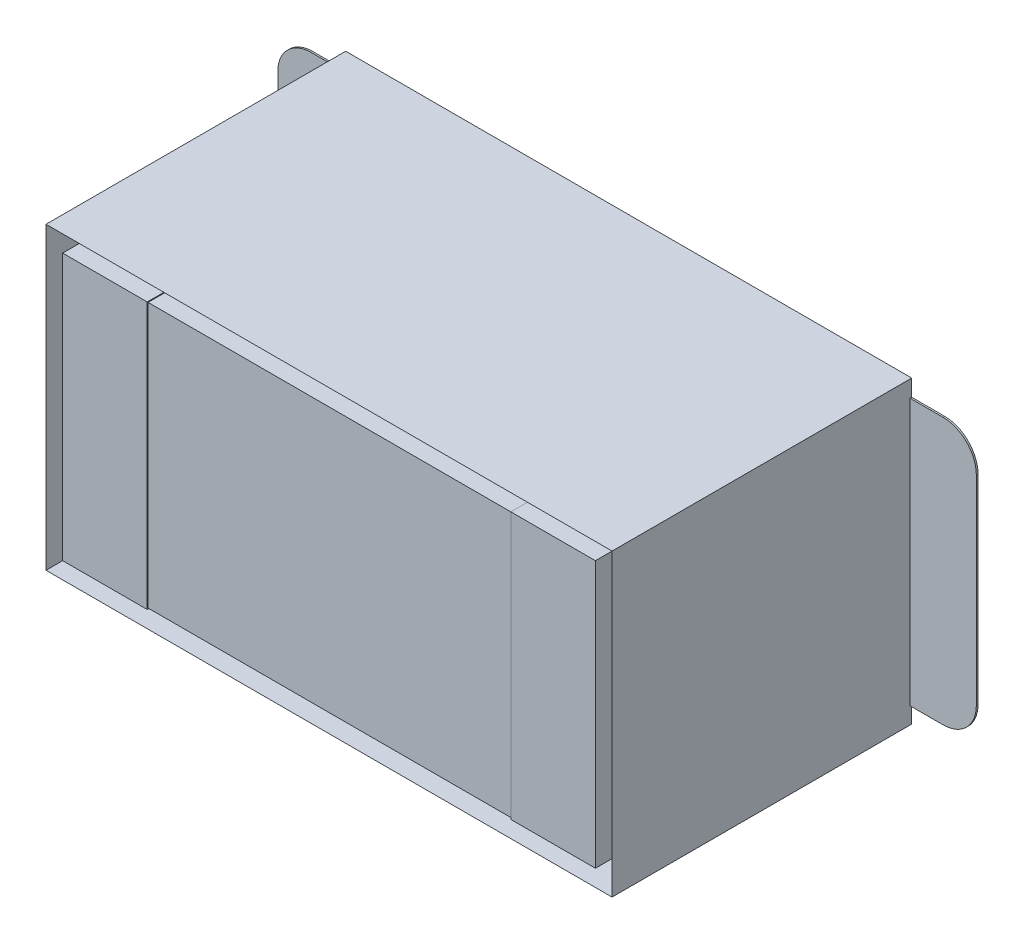
ISO-10303-21;
HEADER;
FILE_DESCRIPTION(('STEP AP214'),'2;1');
FILE_NAME('part.step','',(''),(''),'','','');
FILE_SCHEMA(('AUTOMOTIVE_DESIGN { 1 0 10303 214 1 1 1 1 }'));
ENDSEC;
DATA;
#1=APPLICATION_CONTEXT('core data for automotive mechanical design processes');
#2=APPLICATION_PROTOCOL_DEFINITION('international standard','automotive_design',2000,#1);
#3=PRODUCT_CONTEXT('',#1,'mechanical');
#4=PRODUCT('Part','Part','',(#3));
#5=PRODUCT_RELATED_PRODUCT_CATEGORY('part','',(#4));
#6=PRODUCT_DEFINITION_FORMATION('','',#4);
#7=PRODUCT_DEFINITION_CONTEXT('part definition',#1,'design');
#8=PRODUCT_DEFINITION('design','',#6,#7);
#9=PRODUCT_DEFINITION_SHAPE('','',#8);
#10=(LENGTH_UNIT() NAMED_UNIT(*) SI_UNIT(.MILLI.,.METRE.));
#11=(NAMED_UNIT(*) PLANE_ANGLE_UNIT() SI_UNIT($,.RADIAN.));
#12=(NAMED_UNIT(*) SI_UNIT($,.STERADIAN.) SOLID_ANGLE_UNIT());
#13=UNCERTAINTY_MEASURE_WITH_UNIT(LENGTH_MEASURE(1.E-05),#10,'distance_accuracy_value','');
#14=(GEOMETRIC_REPRESENTATION_CONTEXT(3) GLOBAL_UNCERTAINTY_ASSIGNED_CONTEXT((#13)) GLOBAL_UNIT_ASSIGNED_CONTEXT((#10,
#11,#12)) REPRESENTATION_CONTEXT('',''));
#15=CARTESIAN_POINT('',(0.,0.,0.));
#16=DIRECTION('',(0.,0.,1.));
#17=DIRECTION('',(1.,0.,0.));
#18=AXIS2_PLACEMENT_3D('',#15,#16,#17);
#19=CARTESIAN_POINT('',(-1.898000149415,0.600000149415,0.0762));
#20=DIRECTION('',(0.,0.,1.));
#21=DIRECTION('',(1.,0.,0.));
#22=AXIS2_PLACEMENT_3D('',#19,#20,#21);
#23=CYLINDRICAL_SURFACE('',#22,0.199999850585);
#24=DIRECTION('',(0.,0.,1.));
#25=VECTOR('',#24,1.);
#26=CARTESIAN_POINT('',(-2.098,0.6,0.0762));
#27=LINE('',#26,#25);
#28=CARTESIAN_POINT('',(-2.098,0.6,0.0762));
#29=VERTEX_POINT('',#28);
#30=CARTESIAN_POINT('',(-2.098,0.6,0.0862));
#31=VERTEX_POINT('',#30);
#32=EDGE_CURVE('P0_E11',#29,#31,#27,.T.);
#33=ORIENTED_EDGE('',*,*,#32,.T.);
#34=CARTESIAN_POINT('',(-1.898000149415,0.600000149415,0.0862));
#35=DIRECTION('',(0.,0.,1.));
#36=DIRECTION('',(7.47075740949116E-07,0.999999999999721,0.));
#37=AXIS2_PLACEMENT_3D('',#34,#35,#36);
#38=CIRCLE('',#37,0.199999850585);
#39=CARTESIAN_POINT('',(-1.898,0.8,0.0862));
#40=VERTEX_POINT('',#39);
#41=EDGE_CURVE('P0_E425',#40,#31,#38,.T.);
#42=ORIENTED_EDGE('',*,*,#41,.F.);
#43=DIRECTION('',(0.,0.,1.));
#44=VECTOR('',#43,1.);
#45=CARTESIAN_POINT('',(-1.898,0.8,0.0762));
#46=LINE('',#45,#44);
#47=CARTESIAN_POINT('',(-1.898,0.8,0.0762));
#48=VERTEX_POINT('',#47);
#49=EDGE_CURVE('P0_E451',#48,#40,#46,.T.);
#50=ORIENTED_EDGE('',*,*,#49,.F.);
#51=CARTESIAN_POINT('',(-1.898000149415,0.600000149415,0.0762));
#52=DIRECTION('',(0.,0.,1.));
#53=DIRECTION('',(7.47075740949116E-07,0.999999999999721,0.));
#54=AXIS2_PLACEMENT_3D('',#51,#52,#53);
#55=CIRCLE('',#54,0.199999850585);
#56=EDGE_CURVE('P0_E387',#48,#29,#55,.T.);
#57=ORIENTED_EDGE('',*,*,#56,.T.);
#58=EDGE_LOOP('',(#33,#42,#50,#57));
#59=FACE_BOUND('',#58,.T.);
#60=ADVANCED_FACE('P0_F18',(#59),#23,.T.);
#61=CARTESIAN_POINT('',(-2.098,0.6,0.0762));
#62=DIRECTION('',(-1.,0.,0.));
#63=DIRECTION('',(0.,0.,1.));
#64=AXIS2_PLACEMENT_3D('',#61,#62,#63);
#65=PLANE('',#64);
#66=DIRECTION('',(0.,0.,1.));
#67=VECTOR('',#66,1.);
#68=CARTESIAN_POINT('',(-2.098,-0.6,0.0762));
#69=LINE('',#68,#67);
#70=CARTESIAN_POINT('',(-2.098,-0.6,0.0762));
#71=VERTEX_POINT('',#70);
#72=CARTESIAN_POINT('',(-2.098,-0.6,0.0862));
#73=VERTEX_POINT('',#72);
#74=EDGE_CURVE('P0_E29',#71,#73,#69,.T.);
#75=ORIENTED_EDGE('',*,*,#74,.T.);
#76=DIRECTION('',(0.,-1.,0.));
#77=VECTOR('',#76,1.);
#78=CARTESIAN_POINT('',(-2.098,0.6,0.0862));
#79=LINE('',#78,#77);
#80=EDGE_CURVE('P0_E445',#31,#73,#79,.T.);
#81=ORIENTED_EDGE('',*,*,#80,.F.);
#82=ORIENTED_EDGE('',*,*,#32,.F.);
#83=DIRECTION('',(0.,-1.,0.));
#84=VECTOR('',#83,1.);
#85=CARTESIAN_POINT('',(-2.098,0.6,0.0762));
#86=LINE('',#85,#84);
#87=EDGE_CURVE('P0_E383',#29,#71,#86,.T.);
#88=ORIENTED_EDGE('',*,*,#87,.T.);
#89=EDGE_LOOP('',(#75,#81,#82,#88));
#90=FACE_BOUND('',#89,.T.);
#91=ADVANCED_FACE('P0_F1147',(#90),#65,.T.);
#92=CARTESIAN_POINT('',(-1.898000149415,-0.600000149415,0.0762));
#93=DIRECTION('',(0.,0.,1.));
#94=DIRECTION('',(1.,0.,0.));
#95=AXIS2_PLACEMENT_3D('',#92,#93,#94);
#96=CYLINDRICAL_SURFACE('',#95,0.199999850585);
#97=DIRECTION('',(0.,0.,1.));
#98=VECTOR('',#97,1.);
#99=CARTESIAN_POINT('',(-1.898,-0.8,0.0762));
#100=LINE('',#99,#98);
#101=CARTESIAN_POINT('',(-1.898,-0.8,0.0762));
#102=VERTEX_POINT('',#101);
#103=CARTESIAN_POINT('',(-1.898,-0.8,0.0862));
#104=VERTEX_POINT('',#103);
#105=EDGE_CURVE('P0_E334',#102,#104,#100,.T.);
#106=ORIENTED_EDGE('',*,*,#105,.T.);
#107=CARTESIAN_POINT('',(-1.898000149415,-0.600000149415,0.0862));
#108=DIRECTION('',(0.,0.,1.));
#109=DIRECTION('',(-0.999999999999721,7.47075741504216E-07,0.));
#110=AXIS2_PLACEMENT_3D('',#107,#108,#109);
#111=CIRCLE('',#110,0.199999850585);
#112=EDGE_CURVE('P0_E322',#73,#104,#111,.T.);
#113=ORIENTED_EDGE('',*,*,#112,.F.);
#114=ORIENTED_EDGE('',*,*,#74,.F.);
#115=CARTESIAN_POINT('',(-1.898000149415,-0.600000149415,0.0762));
#116=DIRECTION('',(0.,0.,1.));
#117=DIRECTION('',(-0.999999999999721,7.47075741504216E-07,0.));
#118=AXIS2_PLACEMENT_3D('',#115,#116,#117);
#119=CIRCLE('',#118,0.199999850585);
#120=EDGE_CURVE('P0_E388',#71,#102,#119,.T.);
#121=ORIENTED_EDGE('',*,*,#120,.T.);
#122=EDGE_LOOP('',(#106,#113,#114,#121));
#123=FACE_BOUND('',#122,.T.);
#124=ADVANCED_FACE('P0_F1141',(#123),#96,.T.);
#125=CARTESIAN_POINT('',(-1.047999850585,0.600000149415,0.0762));
#126=DIRECTION('',(0.,0.,1.));
#127=DIRECTION('',(1.,0.,0.));
#128=AXIS2_PLACEMENT_3D('',#125,#126,#127);
#129=CYLINDRICAL_SURFACE('',#128,0.199999850585);
#130=DIRECTION('',(0.,0.,1.));
#131=VECTOR('',#130,1.);
#132=CARTESIAN_POINT('',(-1.048,0.8,0.0762));
#133=LINE('',#132,#131);
#134=CARTESIAN_POINT('',(-1.048,0.8,0.0762));
#135=VERTEX_POINT('',#134);
#136=CARTESIAN_POINT('',(-1.048,0.8,0.0862));
#137=VERTEX_POINT('',#136);
#138=EDGE_CURVE('P0_E349',#135,#137,#133,.T.);
#139=ORIENTED_EDGE('',*,*,#138,.T.);
#140=CARTESIAN_POINT('',(-1.047999850585,0.600000149415,0.0862));
#141=DIRECTION('',(0.,0.,1.));
#142=DIRECTION('',(0.999999999999721,-7.47075741504216E-07,0.));
#143=AXIS2_PLACEMENT_3D('',#140,#141,#142);
#144=CIRCLE('',#143,0.199999850585);
#145=CARTESIAN_POINT('',(-0.848,0.6,0.0862));
#146=VERTEX_POINT('',#145);
#147=EDGE_CURVE('P0_E312',#146,#137,#144,.T.);
#148=ORIENTED_EDGE('',*,*,#147,.F.);
#149=DIRECTION('',(0.,0.,1.));
#150=VECTOR('',#149,1.);
#151=CARTESIAN_POINT('',(-0.848,0.6,0.0762));
#152=LINE('',#151,#150);
#153=CARTESIAN_POINT('',(-0.848,0.6,0.0762));
#154=VERTEX_POINT('',#153);
#155=EDGE_CURVE('P0_E326',#154,#146,#152,.T.);
#156=ORIENTED_EDGE('',*,*,#155,.F.);
#157=CARTESIAN_POINT('',(-1.047999850585,0.600000149415,0.0762));
#158=DIRECTION('',(0.,0.,1.));
#159=DIRECTION('',(0.999999999999721,-7.47075741504216E-07,0.));
#160=AXIS2_PLACEMENT_3D('',#157,#158,#159);
#161=CIRCLE('',#160,0.199999850585);
#162=EDGE_CURVE('P0_E397',#154,#135,#161,.T.);
#163=ORIENTED_EDGE('',*,*,#162,.T.);
#164=EDGE_LOOP('',(#139,#148,#156,#163));
#165=FACE_BOUND('',#164,.T.);
#166=ADVANCED_FACE('P0_F1146',(#165),#129,.T.);
#167=CARTESIAN_POINT('',(-0.848,-0.6,0.0762));
#168=DIRECTION('',(1.,0.,0.));
#169=DIRECTION('',(0.,1.,0.));
#170=AXIS2_PLACEMENT_3D('',#167,#168,#169);
#171=PLANE('',#170);
#172=ORIENTED_EDGE('',*,*,#155,.T.);
#173=DIRECTION('',(0.,1.,0.));
#174=VECTOR('',#173,1.);
#175=CARTESIAN_POINT('',(-0.848,-0.6,0.0862));
#176=LINE('',#175,#174);
#177=CARTESIAN_POINT('',(-0.848,-0.6,0.0862));
#178=VERTEX_POINT('',#177);
#179=EDGE_CURVE('P0_E316',#178,#146,#176,.T.);
#180=ORIENTED_EDGE('',*,*,#179,.F.);
#181=DIRECTION('',(0.,0.,1.));
#182=VECTOR('',#181,1.);
#183=CARTESIAN_POINT('',(-0.848,-0.6,0.0762));
#184=LINE('',#183,#182);
#185=CARTESIAN_POINT('',(-0.848,-0.6,0.0762));
#186=VERTEX_POINT('',#185);
#187=EDGE_CURVE('P0_E323',#186,#178,#184,.T.);
#188=ORIENTED_EDGE('',*,*,#187,.F.);
#189=DIRECTION('',(0.,1.,0.));
#190=VECTOR('',#189,1.);
#191=CARTESIAN_POINT('',(-0.848,-0.6,0.0762));
#192=LINE('',#191,#190);
#193=EDGE_CURVE('P0_E429',#186,#154,#192,.T.);
#194=ORIENTED_EDGE('',*,*,#193,.T.);
#195=EDGE_LOOP('',(#172,#180,#188,#194));
#196=FACE_BOUND('',#195,.T.);
#197=ADVANCED_FACE('P0_F1309',(#196),#171,.T.);
#198=CARTESIAN_POINT('',(-1.047999850585,-0.600000149415,0.0762));
#199=DIRECTION('',(0.,0.,1.));
#200=DIRECTION('',(1.,0.,0.));
#201=AXIS2_PLACEMENT_3D('',#198,#199,#200);
#202=CYLINDRICAL_SURFACE('',#201,0.199999850585);
#203=ORIENTED_EDGE('',*,*,#187,.T.);
#204=CARTESIAN_POINT('',(-1.047999850585,-0.600000149415,0.0862));
#205=DIRECTION('',(0.,0.,1.));
#206=DIRECTION('',(-7.47075742059316E-07,-0.999999999999721,0.));
#207=AXIS2_PLACEMENT_3D('',#204,#205,#206);
#208=CIRCLE('',#207,0.199999850585);
#209=CARTESIAN_POINT('',(-1.048,-0.8,0.0862));
#210=VERTEX_POINT('',#209);
#211=EDGE_CURVE('P0_E470',#210,#178,#208,.T.);
#212=ORIENTED_EDGE('',*,*,#211,.F.);
#213=DIRECTION('',(0.,0.,1.));
#214=VECTOR('',#213,1.);
#215=CARTESIAN_POINT('',(-1.048,-0.8,0.0762));
#216=LINE('',#215,#214);
#217=CARTESIAN_POINT('',(-1.048,-0.8,0.0762));
#218=VERTEX_POINT('',#217);
#219=EDGE_CURVE('P0_E337',#218,#210,#216,.T.);
#220=ORIENTED_EDGE('',*,*,#219,.F.);
#221=CARTESIAN_POINT('',(-1.047999850585,-0.600000149415,0.0762));
#222=DIRECTION('',(0.,0.,1.));
#223=DIRECTION('',(-7.47075742059316E-07,-0.999999999999721,0.));
#224=AXIS2_PLACEMENT_3D('',#221,#222,#223);
#225=CIRCLE('',#224,0.199999850585);
#226=EDGE_CURVE('P0_E479',#218,#186,#225,.T.);
#227=ORIENTED_EDGE('',*,*,#226,.T.);
#228=EDGE_LOOP('',(#203,#212,#220,#227));
#229=FACE_BOUND('',#228,.T.);
#230=ADVANCED_FACE('P0_F1133',(#229),#202,.T.);
#231=CARTESIAN_POINT('',(1.898000149415,0.600000149415,0.0762));
#232=DIRECTION('',(0.,0.,1.));
#233=DIRECTION('',(1.,0.,0.));
#234=AXIS2_PLACEMENT_3D('',#231,#232,#233);
#235=CYLINDRICAL_SURFACE('',#234,0.199999850585);
#236=DIRECTION('',(0.,0.,1.));
#237=VECTOR('',#236,1.);
#238=CARTESIAN_POINT('',(1.898,0.8,0.0762));
#239=LINE('',#238,#237);
#240=CARTESIAN_POINT('',(1.898,0.8,0.0762));
#241=VERTEX_POINT('',#240);
#242=CARTESIAN_POINT('',(1.898,0.8,0.0862));
#243=VERTEX_POINT('',#242);
#244=EDGE_CURVE('P0_E553',#241,#243,#239,.T.);
#245=ORIENTED_EDGE('',*,*,#244,.T.);
#246=CARTESIAN_POINT('',(1.898000149415,0.600000149415,0.0862));
#247=DIRECTION('',(0.,0.,1.));
#248=DIRECTION('',(0.999999999999721,-7.47075741504216E-07,0.));
#249=AXIS2_PLACEMENT_3D('',#246,#247,#248);
#250=CIRCLE('',#249,0.199999850585);
#251=CARTESIAN_POINT('',(2.098,0.6,0.0862));
#252=VERTEX_POINT('',#251);
#253=EDGE_CURVE('P0_E310',#252,#243,#250,.T.);
#254=ORIENTED_EDGE('',*,*,#253,.F.);
#255=DIRECTION('',(0.,0.,1.));
#256=VECTOR('',#255,1.);
#257=CARTESIAN_POINT('',(2.098,0.6,0.0762));
#258=LINE('',#257,#256);
#259=CARTESIAN_POINT('',(2.098,0.6,0.0762));
#260=VERTEX_POINT('',#259);
#261=EDGE_CURVE('P0_E327',#260,#252,#258,.T.);
#262=ORIENTED_EDGE('',*,*,#261,.F.);
#263=CARTESIAN_POINT('',(1.898000149415,0.600000149415,0.0762));
#264=DIRECTION('',(0.,0.,1.));
#265=DIRECTION('',(0.999999999999721,-7.47075741504216E-07,0.));
#266=AXIS2_PLACEMENT_3D('',#263,#264,#265);
#267=CIRCLE('',#266,0.199999850585);
#268=EDGE_CURVE('P0_E473',#260,#241,#267,.T.);
#269=ORIENTED_EDGE('',*,*,#268,.T.);
#270=EDGE_LOOP('',(#245,#254,#262,#269));
#271=FACE_BOUND('',#270,.T.);
#272=ADVANCED_FACE('P0_F643',(#271),#235,.T.);
#273=CARTESIAN_POINT('',(2.098,-0.6,0.0762));
#274=DIRECTION('',(1.,0.,0.));
#275=DIRECTION('',(0.,1.,0.));
#276=AXIS2_PLACEMENT_3D('',#273,#274,#275);
#277=PLANE('',#276);
#278=ORIENTED_EDGE('',*,*,#261,.T.);
#279=DIRECTION('',(0.,1.,0.));
#280=VECTOR('',#279,1.);
#281=CARTESIAN_POINT('',(2.098,-0.6,0.0862));
#282=LINE('',#281,#280);
#283=CARTESIAN_POINT('',(2.098,-0.6,0.0862));
#284=VERTEX_POINT('',#283);
#285=EDGE_CURVE('P0_E306',#284,#252,#282,.T.);
#286=ORIENTED_EDGE('',*,*,#285,.F.);
#287=DIRECTION('',(0.,0.,1.));
#288=VECTOR('',#287,1.);
#289=CARTESIAN_POINT('',(2.098,-0.6,0.0762));
#290=LINE('',#289,#288);
#291=CARTESIAN_POINT('',(2.098,-0.6,0.0762));
#292=VERTEX_POINT('',#291);
#293=EDGE_CURVE('P0_E341',#292,#284,#290,.T.);
#294=ORIENTED_EDGE('',*,*,#293,.F.);
#295=DIRECTION('',(0.,1.,0.));
#296=VECTOR('',#295,1.);
#297=CARTESIAN_POINT('',(2.098,-0.6,0.0762));
#298=LINE('',#297,#296);
#299=EDGE_CURVE('P0_E476',#292,#260,#298,.T.);
#300=ORIENTED_EDGE('',*,*,#299,.T.);
#301=EDGE_LOOP('',(#278,#286,#294,#300));
#302=FACE_BOUND('',#301,.T.);
#303=ADVANCED_FACE('P0_F640',(#302),#277,.T.);
#304=CARTESIAN_POINT('',(1.898000149415,-0.600000149415,0.0762));
#305=DIRECTION('',(0.,0.,1.));
#306=DIRECTION('',(1.,0.,0.));
#307=AXIS2_PLACEMENT_3D('',#304,#305,#306);
#308=CYLINDRICAL_SURFACE('',#307,0.199999850585);
#309=ORIENTED_EDGE('',*,*,#293,.T.);
#310=CARTESIAN_POINT('',(1.898000149415,-0.600000149415,0.0862));
#311=DIRECTION('',(0.,0.,1.));
#312=DIRECTION('',(-7.47075740949116E-07,-0.999999999999721,0.));
#313=AXIS2_PLACEMENT_3D('',#310,#311,#312);
#314=CIRCLE('',#313,0.199999850585);
#315=CARTESIAN_POINT('',(1.898,-0.8,0.0862));
#316=VERTEX_POINT('',#315);
#317=EDGE_CURVE('P0_E311',#316,#284,#314,.T.);
#318=ORIENTED_EDGE('',*,*,#317,.F.);
#319=DIRECTION('',(0.,0.,1.));
#320=VECTOR('',#319,1.);
#321=CARTESIAN_POINT('',(1.898,-0.8,0.0762));
#322=LINE('',#321,#320);
#323=CARTESIAN_POINT('',(1.898,-0.8,0.0762));
#324=VERTEX_POINT('',#323);
#325=EDGE_CURVE('P0_E415',#324,#316,#322,.T.);
#326=ORIENTED_EDGE('',*,*,#325,.F.);
#327=CARTESIAN_POINT('',(1.898000149415,-0.600000149415,0.0762));
#328=DIRECTION('',(0.,0.,1.));
#329=DIRECTION('',(-7.47075740949116E-07,-0.999999999999721,0.));
#330=AXIS2_PLACEMENT_3D('',#327,#328,#329);
#331=CIRCLE('',#330,0.199999850585);
#332=EDGE_CURVE('P0_E541',#324,#292,#331,.T.);
#333=ORIENTED_EDGE('',*,*,#332,.T.);
#334=EDGE_LOOP('',(#309,#318,#326,#333));
#335=FACE_BOUND('',#334,.T.);
#336=ADVANCED_FACE('P0_F636',(#335),#308,.T.);
#337=CARTESIAN_POINT('',(-1.6,0.8,0.0762));
#338=DIRECTION('',(-1.,0.,0.));
#339=DIRECTION('',(0.,0.,1.));
#340=AXIS2_PLACEMENT_3D('',#337,#338,#339);
#341=PLANE('',#340);
#342=DIRECTION('',(0.,0.,1.));
#343=VECTOR('',#342,1.);
#344=CARTESIAN_POINT('',(-1.6,-0.8,0.0862));
#345=LINE('',#344,#343);
#346=CARTESIAN_POINT('',(-1.6,-0.8,0.0862));
#347=VERTEX_POINT('',#346);
#348=CARTESIAN_POINT('',(-1.6,-0.8,1.8762));
#349=VERTEX_POINT('',#348);
#350=EDGE_CURVE('P0_E338',#347,#349,#345,.T.);
#351=ORIENTED_EDGE('',*,*,#350,.T.);
#352=DIRECTION('',(0.,-1.,0.));
#353=VECTOR('',#352,1.);
#354=CARTESIAN_POINT('',(-1.6,0.8,1.8762));
#355=LINE('',#354,#353);
#356=CARTESIAN_POINT('',(-1.6,0.8,1.8762));
#357=VERTEX_POINT('',#356);
#358=EDGE_CURVE('P0_E43',#357,#349,#355,.T.);
#359=ORIENTED_EDGE('',*,*,#358,.F.);
#360=DIRECTION('',(0.,0.,1.));
#361=VECTOR('',#360,1.);
#362=CARTESIAN_POINT('',(-1.6,0.8,0.0862));
#363=LINE('',#362,#361);
#364=CARTESIAN_POINT('',(-1.6,0.8,0.0862));
#365=VERTEX_POINT('',#364);
#366=EDGE_CURVE('P0_E402',#365,#357,#363,.T.);
#367=ORIENTED_EDGE('',*,*,#366,.F.);
#368=DIRECTION('',(0.,1.,0.));
#369=VECTOR('',#368,1.);
#370=CARTESIAN_POINT('',(-1.6,-0.8,0.0862));
#371=LINE('',#370,#369);
#372=EDGE_CURVE('P0_E321',#347,#365,#371,.T.);
#373=ORIENTED_EDGE('',*,*,#372,.F.);
#374=EDGE_LOOP('',(#351,#359,#367,#373));
#375=FACE_BOUND('',#374,.T.);
#376=ADVANCED_FACE('P0_F1173',(#375),#341,.T.);
#377=CARTESIAN_POINT('',(0.,0.,1.8762));
#378=DIRECTION('',(0.,0.,1.));
#379=DIRECTION('',(1.,0.,0.));
#380=AXIS2_PLACEMENT_3D('',#377,#378,#379);
#381=PLANE('',#380);
#382=DIRECTION('',(1.,0.,0.));
#383=VECTOR('',#382,1.);
#384=CARTESIAN_POINT('',(1.092,-0.8,1.8762));
#385=LINE('',#384,#383);
#386=CARTESIAN_POINT('',(1.092,-0.8,1.8762));
#387=VERTEX_POINT('',#386);
#388=CARTESIAN_POINT('',(1.6,-0.8,1.8762));
#389=VERTEX_POINT('',#388);
#390=EDGE_CURVE('P0_E382',#387,#389,#385,.T.);
#391=ORIENTED_EDGE('',*,*,#390,.T.);
#392=DIRECTION('',(0.,1.,0.));
#393=VECTOR('',#392,1.);
#394=CARTESIAN_POINT('',(1.6,-0.8,1.8762));
#395=LINE('',#394,#393);
#396=CARTESIAN_POINT('',(1.6,0.8,1.8762));
#397=VERTEX_POINT('',#396);
#398=EDGE_CURVE('P0_E406',#389,#397,#395,.T.);
#399=ORIENTED_EDGE('',*,*,#398,.T.);
#400=DIRECTION('',(-1.,0.,0.));
#401=VECTOR('',#400,1.);
#402=CARTESIAN_POINT('',(1.6,0.8,1.8762));
#403=LINE('',#402,#401);
#404=CARTESIAN_POINT('',(1.092,0.8,1.8762));
#405=VERTEX_POINT('',#404);
#406=EDGE_CURVE('P0_E328',#397,#405,#403,.T.);
#407=ORIENTED_EDGE('',*,*,#406,.T.);
#408=DIRECTION('',(0.,1.,0.));
#409=VECTOR('',#408,1.);
#410=CARTESIAN_POINT('',(1.092,-0.8,1.8762));
#411=LINE('',#410,#409);
#412=EDGE_CURVE('P0_E293',#387,#405,#411,.T.);
#413=ORIENTED_EDGE('',*,*,#412,.F.);
#414=EDGE_LOOP('',(#391,#399,#407,#413));
#415=FACE_BOUND('',#414,.T.);
#416=ADVANCED_FACE('P0_F631',(#415),#381,.T.);
#417=CARTESIAN_POINT('',(0.,0.,1.8762));
#418=DIRECTION('',(0.,0.,1.));
#419=DIRECTION('',(1.,0.,0.));
#420=AXIS2_PLACEMENT_3D('',#417,#418,#419);
#421=PLANE('',#420);
#422=DIRECTION('',(-1.,0.,0.));
#423=VECTOR('',#422,1.);
#424=CARTESIAN_POINT('',(-1.092,0.8,1.8762));
#425=LINE('',#424,#423);
#426=CARTESIAN_POINT('',(-1.092,0.8,1.8762));
#427=VERTEX_POINT('',#426);
#428=EDGE_CURVE('P0_E398',#427,#357,#425,.T.);
#429=ORIENTED_EDGE('',*,*,#428,.T.);
#430=ORIENTED_EDGE('',*,*,#358,.T.);
#431=DIRECTION('',(1.,0.,0.));
#432=VECTOR('',#431,1.);
#433=CARTESIAN_POINT('',(-1.6,-0.8,1.8762));
#434=LINE('',#433,#432);
#435=CARTESIAN_POINT('',(-1.092,-0.8,1.8762));
#436=VERTEX_POINT('',#435);
#437=EDGE_CURVE('P0_E381',#349,#436,#434,.T.);
#438=ORIENTED_EDGE('',*,*,#437,.T.);
#439=DIRECTION('',(0.,1.,0.));
#440=VECTOR('',#439,1.);
#441=CARTESIAN_POINT('',(-1.092,-0.8,1.8762));
#442=LINE('',#441,#440);
#443=EDGE_CURVE('P0_E365',#436,#427,#442,.T.);
#444=ORIENTED_EDGE('',*,*,#443,.T.);
#445=EDGE_LOOP('',(#429,#430,#438,#444));
#446=FACE_BOUND('',#445,.T.);
#447=ADVANCED_FACE('P0_F1157',(#446),#421,.T.);
#448=CARTESIAN_POINT('',(1.047999850585,0.600000149415,0.0762));
#449=DIRECTION('',(0.,0.,1.));
#450=DIRECTION('',(1.,0.,0.));
#451=AXIS2_PLACEMENT_3D('',#448,#449,#450);
#452=CYLINDRICAL_SURFACE('',#451,0.199999850585);
#453=DIRECTION('',(0.,0.,1.));
#454=VECTOR('',#453,1.);
#455=CARTESIAN_POINT('',(0.848,0.6,0.0762));
#456=LINE('',#455,#454);
#457=CARTESIAN_POINT('',(0.848,0.6,0.0762));
#458=VERTEX_POINT('',#457);
#459=CARTESIAN_POINT('',(0.848,0.6,0.0862));
#460=VERTEX_POINT('',#459);
#461=EDGE_CURVE('P0_E346',#458,#460,#456,.T.);
#462=ORIENTED_EDGE('',*,*,#461,.T.);
#463=CARTESIAN_POINT('',(1.047999850585,0.600000149415,0.0862));
#464=DIRECTION('',(0.,0.,1.));
#465=DIRECTION('',(7.47075742059316E-07,0.999999999999721,0.));
#466=AXIS2_PLACEMENT_3D('',#463,#464,#465);
#467=CIRCLE('',#466,0.199999850585);
#468=CARTESIAN_POINT('',(1.048,0.8,0.0862));
#469=VERTEX_POINT('',#468);
#470=EDGE_CURVE('P0_E315',#469,#460,#467,.T.);
#471=ORIENTED_EDGE('',*,*,#470,.F.);
#472=DIRECTION('',(0.,0.,1.));
#473=VECTOR('',#472,1.);
#474=CARTESIAN_POINT('',(1.048,0.8,0.0762));
#475=LINE('',#474,#473);
#476=CARTESIAN_POINT('',(1.048,0.8,0.0762));
#477=VERTEX_POINT('',#476);
#478=EDGE_CURVE('P0_E545',#477,#469,#475,.T.);
#479=ORIENTED_EDGE('',*,*,#478,.F.);
#480=CARTESIAN_POINT('',(1.047999850585,0.600000149415,0.0762));
#481=DIRECTION('',(0.,0.,1.));
#482=DIRECTION('',(7.47075742059316E-07,0.999999999999721,0.));
#483=AXIS2_PLACEMENT_3D('',#480,#481,#482);
#484=CIRCLE('',#483,0.199999850585);
#485=EDGE_CURVE('P0_E392',#477,#458,#484,.T.);
#486=ORIENTED_EDGE('',*,*,#485,.T.);
#487=EDGE_LOOP('',(#462,#471,#479,#486));
#488=FACE_BOUND('',#487,.T.);
#489=ADVANCED_FACE('P0_F593',(#488),#452,.T.);
#490=CARTESIAN_POINT('',(0.848,0.6,0.0762));
#491=DIRECTION('',(-1.,0.,0.));
#492=DIRECTION('',(0.,0.,1.));
#493=AXIS2_PLACEMENT_3D('',#490,#491,#492);
#494=PLANE('',#493);
#495=DIRECTION('',(0.,0.,1.));
#496=VECTOR('',#495,1.);
#497=CARTESIAN_POINT('',(0.848,-0.6,0.0762));
#498=LINE('',#497,#496);
#499=CARTESIAN_POINT('',(0.848,-0.6,0.0762));
#500=VERTEX_POINT('',#499);
#501=CARTESIAN_POINT('',(0.848,-0.6,0.0862));
#502=VERTEX_POINT('',#501);
#503=EDGE_CURVE('P0_E22',#500,#502,#498,.T.);
#504=ORIENTED_EDGE('',*,*,#503,.T.);
#505=DIRECTION('',(0.,-1.,0.));
#506=VECTOR('',#505,1.);
#507=CARTESIAN_POINT('',(0.848,0.6,0.0862));
#508=LINE('',#507,#506);
#509=EDGE_CURVE('P0_E411',#460,#502,#508,.T.);
#510=ORIENTED_EDGE('',*,*,#509,.F.);
#511=ORIENTED_EDGE('',*,*,#461,.F.);
#512=DIRECTION('',(0.,-1.,0.));
#513=VECTOR('',#512,1.);
#514=CARTESIAN_POINT('',(0.848,0.6,0.0762));
#515=LINE('',#514,#513);
#516=EDGE_CURVE('P0_E376',#458,#500,#515,.T.);
#517=ORIENTED_EDGE('',*,*,#516,.T.);
#518=EDGE_LOOP('',(#504,#510,#511,#517));
#519=FACE_BOUND('',#518,.T.);
#520=ADVANCED_FACE('P0_F1299',(#519),#494,.T.);
#521=CARTESIAN_POINT('',(1.047999850585,-0.600000149415,0.0762));
#522=DIRECTION('',(0.,0.,1.));
#523=DIRECTION('',(1.,0.,0.));
#524=AXIS2_PLACEMENT_3D('',#521,#522,#523);
#525=CYLINDRICAL_SURFACE('',#524,0.199999850585);
#526=DIRECTION('',(0.,0.,1.));
#527=VECTOR('',#526,1.);
#528=CARTESIAN_POINT('',(1.048,-0.8,0.0762));
#529=LINE('',#528,#527);
#530=CARTESIAN_POINT('',(1.048,-0.8,0.0762));
#531=VERTEX_POINT('',#530);
#532=CARTESIAN_POINT('',(1.048,-0.8,0.0862));
#533=VERTEX_POINT('',#532);
#534=EDGE_CURVE('P0_E378',#531,#533,#529,.T.);
#535=ORIENTED_EDGE('',*,*,#534,.T.);
#536=CARTESIAN_POINT('',(1.047999850585,-0.600000149415,0.0862));
#537=DIRECTION('',(0.,0.,1.));
#538=DIRECTION('',(-0.999999999999721,7.47075741504216E-07,0.));
#539=AXIS2_PLACEMENT_3D('',#536,#537,#538);
#540=CIRCLE('',#539,0.199999850585);
#541=EDGE_CURVE('P0_E407',#502,#533,#540,.T.);
#542=ORIENTED_EDGE('',*,*,#541,.F.);
#543=ORIENTED_EDGE('',*,*,#503,.F.);
#544=CARTESIAN_POINT('',(1.047999850585,-0.600000149415,0.0762));
#545=DIRECTION('',(0.,0.,1.));
#546=DIRECTION('',(-0.999999999999721,7.47075741504216E-07,0.));
#547=AXIS2_PLACEMENT_3D('',#544,#545,#546);
#548=CIRCLE('',#547,0.199999850585);
#549=EDGE_CURVE('P0_E372',#500,#531,#548,.T.);
#550=ORIENTED_EDGE('',*,*,#549,.T.);
#551=EDGE_LOOP('',(#535,#542,#543,#550));
#552=FACE_BOUND('',#551,.T.);
#553=ADVANCED_FACE('P0_F574',(#552),#525,.T.);
#554=CARTESIAN_POINT('',(-1.6,-0.8,0.0762));
#555=DIRECTION('',(0.,-1.,0.));
#556=DIRECTION('',(0.,0.,-1.));
#557=AXIS2_PLACEMENT_3D('',#554,#555,#556);
#558=PLANE('',#557);
#559=ORIENTED_EDGE('',*,*,#437,.F.);
#560=ORIENTED_EDGE('',*,*,#350,.F.);
#561=DIRECTION('',(1.,0.,0.));
#562=VECTOR('',#561,1.);
#563=CARTESIAN_POINT('',(-1.898,-0.8,0.0862));
#564=LINE('',#563,#562);
#565=EDGE_CURVE('P0_E317',#104,#347,#564,.T.);
#566=ORIENTED_EDGE('',*,*,#565,.F.);
#567=ORIENTED_EDGE('',*,*,#105,.F.);
#568=DIRECTION('',(-1.,0.,0.));
#569=VECTOR('',#568,1.);
#570=CARTESIAN_POINT('',(-1.048,-0.8,0.0762));
#571=LINE('',#570,#569);
#572=EDGE_CURVE('P0_E333',#218,#102,#571,.T.);
#573=ORIENTED_EDGE('',*,*,#572,.F.);
#574=ORIENTED_EDGE('',*,*,#219,.T.);
#575=DIRECTION('',(1.,0.,0.));
#576=VECTOR('',#575,1.);
#577=CARTESIAN_POINT('',(-1.092,-0.8,0.0862));
#578=LINE('',#577,#576);
#579=CARTESIAN_POINT('',(-1.092,-0.8,0.0862));
#580=VERTEX_POINT('',#579);
#581=EDGE_CURVE('P0_E466',#580,#210,#578,.T.);
#582=ORIENTED_EDGE('',*,*,#581,.F.);
#583=DIRECTION('',(0.,0.,1.));
#584=VECTOR('',#583,1.);
#585=CARTESIAN_POINT('',(-1.092,-0.8,0.0862));
#586=LINE('',#585,#584);
#587=EDGE_CURVE('P0_E305',#580,#436,#586,.T.);
#588=ORIENTED_EDGE('',*,*,#587,.T.);
#589=EDGE_LOOP('',(#559,#560,#566,#567,#573,#574,#582,#588));
#590=FACE_BOUND('',#589,.T.);
#591=ADVANCED_FACE('P0_F1107',(#590),#558,.T.);
#592=CARTESIAN_POINT('',(-1.6,-0.8,0.0762));
#593=DIRECTION('',(0.,-1.,0.));
#594=DIRECTION('',(0.,0.,-1.));
#595=AXIS2_PLACEMENT_3D('',#592,#593,#594);
#596=PLANE('',#595);
#597=ORIENTED_EDGE('',*,*,#325,.T.);
#598=DIRECTION('',(1.,0.,0.));
#599=VECTOR('',#598,1.);
#600=CARTESIAN_POINT('',(1.6,-0.8,0.0862));
#601=LINE('',#600,#599);
#602=CARTESIAN_POINT('',(1.6,-0.8,0.0862));
#603=VERTEX_POINT('',#602);
#604=EDGE_CURVE('P0_E344',#603,#316,#601,.T.);
#605=ORIENTED_EDGE('',*,*,#604,.F.);
#606=DIRECTION('',(0.,0.,1.));
#607=VECTOR('',#606,1.);
#608=CARTESIAN_POINT('',(1.6,-0.8,0.0862));
#609=LINE('',#608,#607);
#610=EDGE_CURVE('P0_E418',#603,#389,#609,.T.);
#611=ORIENTED_EDGE('',*,*,#610,.T.);
#612=ORIENTED_EDGE('',*,*,#390,.F.);
#613=DIRECTION('',(0.,0.,1.));
#614=VECTOR('',#613,1.);
#615=CARTESIAN_POINT('',(1.092,-0.8,0.0862));
#616=LINE('',#615,#614);
#617=CARTESIAN_POINT('',(1.092,-0.8,0.0862));
#618=VERTEX_POINT('',#617);
#619=EDGE_CURVE('P0_E353',#618,#387,#616,.T.);
#620=ORIENTED_EDGE('',*,*,#619,.F.);
#621=DIRECTION('',(1.,0.,0.));
#622=VECTOR('',#621,1.);
#623=CARTESIAN_POINT('',(1.048,-0.8,0.0862));
#624=LINE('',#623,#622);
#625=EDGE_CURVE('P0_E403',#533,#618,#624,.T.);
#626=ORIENTED_EDGE('',*,*,#625,.F.);
#627=ORIENTED_EDGE('',*,*,#534,.F.);
#628=DIRECTION('',(-1.,0.,0.));
#629=VECTOR('',#628,1.);
#630=CARTESIAN_POINT('',(1.898,-0.8,0.0762));
#631=LINE('',#630,#629);
#632=EDGE_CURVE('P0_E377',#324,#531,#631,.T.);
#633=ORIENTED_EDGE('',*,*,#632,.F.);
#634=EDGE_LOOP('',(#597,#605,#611,#612,#620,#626,#627,#633));
#635=FACE_BOUND('',#634,.T.);
#636=ADVANCED_FACE('P0_F580',(#635),#596,.T.);
#637=CARTESIAN_POINT('',(1.6,-0.8,0.0762));
#638=DIRECTION('',(1.,0.,0.));
#639=DIRECTION('',(0.,1.,0.));
#640=AXIS2_PLACEMENT_3D('',#637,#638,#639);
#641=PLANE('',#640);
#642=DIRECTION('',(0.,0.,1.));
#643=VECTOR('',#642,1.);
#644=CARTESIAN_POINT('',(1.6,0.8,0.0862));
#645=LINE('',#644,#643);
#646=CARTESIAN_POINT('',(1.6,0.8,0.0862));
#647=VERTEX_POINT('',#646);
#648=EDGE_CURVE('P0_E332',#647,#397,#645,.T.);
#649=ORIENTED_EDGE('',*,*,#648,.T.);
#650=ORIENTED_EDGE('',*,*,#398,.F.);
#651=ORIENTED_EDGE('',*,*,#610,.F.);
#652=DIRECTION('',(0.,1.,0.));
#653=VECTOR('',#652,1.);
#654=CARTESIAN_POINT('',(1.6,-0.8,0.0862));
#655=LINE('',#654,#653);
#656=EDGE_CURVE('P0_E357',#603,#647,#655,.T.);
#657=ORIENTED_EDGE('',*,*,#656,.T.);
#658=EDGE_LOOP('',(#649,#650,#651,#657));
#659=FACE_BOUND('',#658,.T.);
#660=ADVANCED_FACE('P0_F632',(#659),#641,.T.);
#661=CARTESIAN_POINT('',(0.,0.,0.0862));
#662=DIRECTION('',(0.,0.,1.));
#663=DIRECTION('',(1.,0.,0.));
#664=AXIS2_PLACEMENT_3D('',#661,#662,#663);
#665=PLANE('',#664);
#666=DIRECTION('',(-1.,0.,0.));
#667=VECTOR('',#666,1.);
#668=CARTESIAN_POINT('',(1.092,0.8,0.0862));
#669=LINE('',#668,#667);
#670=CARTESIAN_POINT('',(1.092,0.8,0.0862));
#671=VERTEX_POINT('',#670);
#672=EDGE_CURVE('P0_E542',#671,#469,#669,.T.);
#673=ORIENTED_EDGE('',*,*,#672,.T.);
#674=ORIENTED_EDGE('',*,*,#470,.T.);
#675=ORIENTED_EDGE('',*,*,#509,.T.);
#676=ORIENTED_EDGE('',*,*,#541,.T.);
#677=ORIENTED_EDGE('',*,*,#625,.T.);
#678=DIRECTION('',(0.,1.,0.));
#679=VECTOR('',#678,1.);
#680=CARTESIAN_POINT('',(1.092,-0.8,0.0862));
#681=LINE('',#680,#679);
#682=EDGE_CURVE('P0_E283',#618,#671,#681,.T.);
#683=ORIENTED_EDGE('',*,*,#682,.T.);
#684=EDGE_LOOP('',(#673,#674,#675,#676,#677,#683));
#685=FACE_BOUND('',#684,.T.);
#686=ADVANCED_FACE('P0_F568',(#685),#665,.T.);
#687=CARTESIAN_POINT('',(0.,0.,0.0862));
#688=DIRECTION('',(0.,0.,1.));
#689=DIRECTION('',(1.,0.,0.));
#690=AXIS2_PLACEMENT_3D('',#687,#688,#689);
#691=PLANE('',#690);
#692=ORIENTED_EDGE('',*,*,#581,.T.);
#693=ORIENTED_EDGE('',*,*,#211,.T.);
#694=ORIENTED_EDGE('',*,*,#179,.T.);
#695=ORIENTED_EDGE('',*,*,#147,.T.);
#696=DIRECTION('',(-1.,0.,0.));
#697=VECTOR('',#696,1.);
#698=CARTESIAN_POINT('',(-1.048,0.8,0.0862));
#699=LINE('',#698,#697);
#700=CARTESIAN_POINT('',(-1.092,0.8,0.0862));
#701=VERTEX_POINT('',#700);
#702=EDGE_CURVE('P0_E354',#137,#701,#699,.T.);
#703=ORIENTED_EDGE('',*,*,#702,.T.);
#704=DIRECTION('',(0.,1.,0.));
#705=VECTOR('',#704,1.);
#706=CARTESIAN_POINT('',(-1.092,-0.8,0.0862));
#707=LINE('',#706,#705);
#708=EDGE_CURVE('P0_E301',#580,#701,#707,.T.);
#709=ORIENTED_EDGE('',*,*,#708,.F.);
#710=EDGE_LOOP('',(#692,#693,#694,#695,#703,#709));
#711=FACE_BOUND('',#710,.T.);
#712=ADVANCED_FACE('P0_F20',(#711),#691,.T.);
#713=CARTESIAN_POINT('',(0.,0.,0.0862));
#714=DIRECTION('',(0.,0.,1.));
#715=DIRECTION('',(1.,0.,0.));
#716=AXIS2_PLACEMENT_3D('',#713,#714,#715);
#717=PLANE('',#716);
#718=DIRECTION('',(-1.,0.,0.));
#719=VECTOR('',#718,1.);
#720=CARTESIAN_POINT('',(-1.6,0.8,0.0862));
#721=LINE('',#720,#719);
#722=EDGE_CURVE('P0_E455',#365,#40,#721,.T.);
#723=ORIENTED_EDGE('',*,*,#722,.T.);
#724=ORIENTED_EDGE('',*,*,#41,.T.);
#725=ORIENTED_EDGE('',*,*,#80,.T.);
#726=ORIENTED_EDGE('',*,*,#112,.T.);
#727=ORIENTED_EDGE('',*,*,#565,.T.);
#728=ORIENTED_EDGE('',*,*,#372,.T.);
#729=EDGE_LOOP('',(#723,#724,#725,#726,#727,#728));
#730=FACE_BOUND('',#729,.T.);
#731=ADVANCED_FACE('P0_F1216',(#730),#717,.T.);
#732=CARTESIAN_POINT('',(0.,0.,0.0862));
#733=DIRECTION('',(0.,0.,1.));
#734=DIRECTION('',(1.,0.,0.));
#735=AXIS2_PLACEMENT_3D('',#732,#733,#734);
#736=PLANE('',#735);
#737=ORIENTED_EDGE('',*,*,#604,.T.);
#738=ORIENTED_EDGE('',*,*,#317,.T.);
#739=ORIENTED_EDGE('',*,*,#285,.T.);
#740=ORIENTED_EDGE('',*,*,#253,.T.);
#741=DIRECTION('',(-1.,0.,0.));
#742=VECTOR('',#741,1.);
#743=CARTESIAN_POINT('',(1.898,0.8,0.0862));
#744=LINE('',#743,#742);
#745=EDGE_CURVE('P0_E297',#243,#647,#744,.T.);
#746=ORIENTED_EDGE('',*,*,#745,.T.);
#747=ORIENTED_EDGE('',*,*,#656,.F.);
#748=EDGE_LOOP('',(#737,#738,#739,#740,#746,#747));
#749=FACE_BOUND('',#748,.T.);
#750=ADVANCED_FACE('P0_F627',(#749),#736,.T.);
#751=CARTESIAN_POINT('',(-1.092,0.8,1.8712));
#752=DIRECTION('',(0.,0.,-1.));
#753=DIRECTION('',(0.,-1.,0.));
#754=AXIS2_PLACEMENT_3D('',#751,#752,#753);
#755=PLANE('',#754);
#756=DIRECTION('',(0.,-1.,0.));
#757=VECTOR('',#756,1.);
#758=CARTESIAN_POINT('',(-1.092,0.795,1.8712));
#759=LINE('',#758,#757);
#760=CARTESIAN_POINT('',(-1.092,0.795,1.8712));
#761=VERTEX_POINT('',#760);
#762=CARTESIAN_POINT('',(-1.092,-0.795,1.8712));
#763=VERTEX_POINT('',#762);
#764=EDGE_CURVE('P0_E304',#761,#763,#759,.T.);
#765=ORIENTED_EDGE('',*,*,#764,.T.);
#766=DIRECTION('',(1.,0.,0.));
#767=VECTOR('',#766,1.);
#768=CARTESIAN_POINT('',(-1.092,-0.795,1.8712));
#769=LINE('',#768,#767);
#770=CARTESIAN_POINT('',(1.092,-0.795,1.8712));
#771=VERTEX_POINT('',#770);
#772=EDGE_CURVE('P0_E279',#763,#771,#769,.T.);
#773=ORIENTED_EDGE('',*,*,#772,.T.);
#774=DIRECTION('',(0.,-1.,0.));
#775=VECTOR('',#774,1.);
#776=CARTESIAN_POINT('',(1.092,0.795,1.8712));
#777=LINE('',#776,#775);
#778=CARTESIAN_POINT('',(1.092,0.795,1.8712));
#779=VERTEX_POINT('',#778);
#780=EDGE_CURVE('P0_E273',#779,#771,#777,.T.);
#781=ORIENTED_EDGE('',*,*,#780,.F.);
#782=DIRECTION('',(1.,0.,0.));
#783=VECTOR('',#782,1.);
#784=CARTESIAN_POINT('',(-1.092,0.795,1.8712));
#785=LINE('',#784,#783);
#786=EDGE_CURVE('P0_E254',#761,#779,#785,.T.);
#787=ORIENTED_EDGE('',*,*,#786,.F.);
#788=EDGE_LOOP('',(#765,#773,#781,#787));
#789=FACE_BOUND('',#788,.T.);
#790=ADVANCED_FACE('P0_F278',(#789),#755,.F.);
#791=CARTESIAN_POINT('',(-1.092,-0.795,1.8762));
#792=DIRECTION('',(0.,1.,0.));
#793=DIRECTION('',(1.,0.,0.));
#794=AXIS2_PLACEMENT_3D('',#791,#792,#793);
#795=PLANE('',#794);
#796=DIRECTION('',(0.,0.,-1.));
#797=VECTOR('',#796,1.);
#798=CARTESIAN_POINT('',(1.092,-0.795,1.8712));
#799=LINE('',#798,#797);
#800=CARTESIAN_POINT('',(1.092,-0.795,0.0912));
#801=VERTEX_POINT('',#800);
#802=EDGE_CURVE('P0_E282',#771,#801,#799,.T.);
#803=ORIENTED_EDGE('',*,*,#802,.F.);
#804=ORIENTED_EDGE('',*,*,#772,.F.);
#805=DIRECTION('',(0.,0.,-1.));
#806=VECTOR('',#805,1.);
#807=CARTESIAN_POINT('',(-1.092,-0.795,1.8712));
#808=LINE('',#807,#806);
#809=CARTESIAN_POINT('',(-1.092,-0.795,0.0912));
#810=VERTEX_POINT('',#809);
#811=EDGE_CURVE('P0_E345',#763,#810,#808,.T.);
#812=ORIENTED_EDGE('',*,*,#811,.T.);
#813=DIRECTION('',(1.,0.,0.));
#814=VECTOR('',#813,1.);
#815=CARTESIAN_POINT('',(-1.092,-0.795,0.0912));
#816=LINE('',#815,#814);
#817=EDGE_CURVE('P0_E299',#810,#801,#816,.T.);
#818=ORIENTED_EDGE('',*,*,#817,.T.);
#819=EDGE_LOOP('',(#803,#804,#812,#818));
#820=FACE_BOUND('',#819,.T.);
#821=ADVANCED_FACE('P0_F519',(#820),#795,.F.);
#822=CARTESIAN_POINT('',(-1.092,-0.8,0.0762));
#823=DIRECTION('',(-1.,0.,0.));
#824=DIRECTION('',(0.,0.,1.));
#825=AXIS2_PLACEMENT_3D('',#822,#823,#824);
#826=PLANE('',#825);
#827=ORIENTED_EDGE('',*,*,#764,.F.);
#828=DIRECTION('',(0.,0.,1.));
#829=VECTOR('',#828,1.);
#830=CARTESIAN_POINT('',(-1.092,0.795,0.0912));
#831=LINE('',#830,#829);
#832=CARTESIAN_POINT('',(-1.092,0.795,0.0912));
#833=VERTEX_POINT('',#832);
#834=EDGE_CURVE('P0_E261',#833,#761,#831,.T.);
#835=ORIENTED_EDGE('',*,*,#834,.F.);
#836=DIRECTION('',(0.,1.,0.));
#837=VECTOR('',#836,1.);
#838=CARTESIAN_POINT('',(-1.092,-0.795,0.0912));
#839=LINE('',#838,#837);
#840=EDGE_CURVE('P0_E448',#810,#833,#839,.T.);
#841=ORIENTED_EDGE('',*,*,#840,.F.);
#842=ORIENTED_EDGE('',*,*,#811,.F.);
#843=EDGE_LOOP('',(#827,#835,#841,#842));
#844=FACE_BOUND('',#843,.T.);
#845=DIRECTION('',(0.,0.,1.));
#846=VECTOR('',#845,1.);
#847=CARTESIAN_POINT('',(-1.092,0.8,0.0862));
#848=LINE('',#847,#846);
#849=EDGE_CURVE('P0_E401',#701,#427,#848,.T.);
#850=ORIENTED_EDGE('',*,*,#849,.T.);
#851=ORIENTED_EDGE('',*,*,#443,.F.);
#852=ORIENTED_EDGE('',*,*,#587,.F.);
#853=ORIENTED_EDGE('',*,*,#708,.T.);
#854=EDGE_LOOP('',(#850,#851,#852,#853));
#855=FACE_BOUND('',#854,.T.);
#856=ADVANCED_FACE('P0_F523',(#844,#855),#826,.F.);
#857=CARTESIAN_POINT('',(0.,0.,0.0912));
#858=DIRECTION('',(0.,0.,-1.));
#859=DIRECTION('',(0.,-1.,0.));
#860=AXIS2_PLACEMENT_3D('',#857,#858,#859);
#861=PLANE('',#860);
#862=DIRECTION('',(0.,-1.,0.));
#863=VECTOR('',#862,1.);
#864=CARTESIAN_POINT('',(1.092,0.795,0.0912));
#865=LINE('',#864,#863);
#866=CARTESIAN_POINT('',(1.092,0.795,0.0912));
#867=VERTEX_POINT('',#866);
#868=EDGE_CURVE('P0_E275',#867,#801,#865,.T.);
#869=ORIENTED_EDGE('',*,*,#868,.T.);
#870=ORIENTED_EDGE('',*,*,#817,.F.);
#871=ORIENTED_EDGE('',*,*,#840,.T.);
#872=DIRECTION('',(1.,0.,0.));
#873=VECTOR('',#872,1.);
#874=CARTESIAN_POINT('',(-1.092,0.795,0.0912));
#875=LINE('',#874,#873);
#876=EDGE_CURVE('P0_E266',#833,#867,#875,.T.);
#877=ORIENTED_EDGE('',*,*,#876,.T.);
#878=EDGE_LOOP('',(#869,#870,#871,#877));
#879=FACE_BOUND('',#878,.T.);
#880=ADVANCED_FACE('P0_F526',(#879),#861,.T.);
#881=CARTESIAN_POINT('',(-1.092,0.795,0.0762));
#882=DIRECTION('',(0.,-1.,0.));
#883=DIRECTION('',(0.,0.,-1.));
#884=AXIS2_PLACEMENT_3D('',#881,#882,#883);
#885=PLANE('',#884);
#886=ORIENTED_EDGE('',*,*,#834,.T.);
#887=ORIENTED_EDGE('',*,*,#786,.T.);
#888=DIRECTION('',(0.,0.,1.));
#889=VECTOR('',#888,1.);
#890=CARTESIAN_POINT('',(1.092,0.795,0.0912));
#891=LINE('',#890,#889);
#892=EDGE_CURVE('P0_E258',#867,#779,#891,.T.);
#893=ORIENTED_EDGE('',*,*,#892,.F.);
#894=ORIENTED_EDGE('',*,*,#876,.F.);
#895=EDGE_LOOP('',(#886,#887,#893,#894));
#896=FACE_BOUND('',#895,.T.);
#897=ADVANCED_FACE('P0_F256',(#896),#885,.F.);
#898=CARTESIAN_POINT('',(1.092,-0.8,0.0812));
#899=DIRECTION('',(1.,0.,0.));
#900=DIRECTION('',(0.,1.,0.));
#901=AXIS2_PLACEMENT_3D('',#898,#899,#900);
#902=PLANE('',#901);
#903=ORIENTED_EDGE('',*,*,#780,.T.);
#904=ORIENTED_EDGE('',*,*,#802,.T.);
#905=ORIENTED_EDGE('',*,*,#868,.F.);
#906=ORIENTED_EDGE('',*,*,#892,.T.);
#907=EDGE_LOOP('',(#903,#904,#905,#906));
#908=FACE_BOUND('',#907,.T.);
#909=ORIENTED_EDGE('',*,*,#619,.T.);
#910=ORIENTED_EDGE('',*,*,#412,.T.);
#911=DIRECTION('',(0.,0.,1.));
#912=VECTOR('',#911,1.);
#913=CARTESIAN_POINT('',(1.092,0.8,0.0862));
#914=LINE('',#913,#912);
#915=EDGE_CURVE('P0_E456',#671,#405,#914,.T.);
#916=ORIENTED_EDGE('',*,*,#915,.F.);
#917=ORIENTED_EDGE('',*,*,#682,.F.);
#918=EDGE_LOOP('',(#909,#910,#916,#917));
#919=FACE_BOUND('',#918,.T.);
#920=ADVANCED_FACE('P0_F270',(#908,#919),#902,.F.);
#921=CARTESIAN_POINT('',(1.6,0.8,0.0762));
#922=DIRECTION('',(0.,1.,0.));
#923=DIRECTION('',(1.,0.,0.));
#924=AXIS2_PLACEMENT_3D('',#921,#922,#923);
#925=PLANE('',#924);
#926=ORIENTED_EDGE('',*,*,#49,.T.);
#927=ORIENTED_EDGE('',*,*,#722,.F.);
#928=ORIENTED_EDGE('',*,*,#366,.T.);
#929=ORIENTED_EDGE('',*,*,#428,.F.);
#930=ORIENTED_EDGE('',*,*,#849,.F.);
#931=ORIENTED_EDGE('',*,*,#702,.F.);
#932=ORIENTED_EDGE('',*,*,#138,.F.);
#933=DIRECTION('',(1.,0.,0.));
#934=VECTOR('',#933,1.);
#935=CARTESIAN_POINT('',(-1.898,0.8,0.0762));
#936=LINE('',#935,#934);
#937=EDGE_CURVE('P0_E393',#48,#135,#936,.T.);
#938=ORIENTED_EDGE('',*,*,#937,.F.);
#939=EDGE_LOOP('',(#926,#927,#928,#929,#930,#931,#932,#938));
#940=FACE_BOUND('',#939,.T.);
#941=ADVANCED_FACE('P0_F1352',(#940),#925,.T.);
#942=CARTESIAN_POINT('',(1.6,0.8,0.0762));
#943=DIRECTION('',(0.,1.,0.));
#944=DIRECTION('',(1.,0.,0.));
#945=AXIS2_PLACEMENT_3D('',#942,#943,#944);
#946=PLANE('',#945);
#947=ORIENTED_EDGE('',*,*,#406,.F.);
#948=ORIENTED_EDGE('',*,*,#648,.F.);
#949=ORIENTED_EDGE('',*,*,#745,.F.);
#950=ORIENTED_EDGE('',*,*,#244,.F.);
#951=DIRECTION('',(1.,0.,0.));
#952=VECTOR('',#951,1.);
#953=CARTESIAN_POINT('',(1.048,0.8,0.0762));
#954=LINE('',#953,#952);
#955=EDGE_CURVE('P0_E435',#477,#241,#954,.T.);
#956=ORIENTED_EDGE('',*,*,#955,.F.);
#957=ORIENTED_EDGE('',*,*,#478,.T.);
#958=ORIENTED_EDGE('',*,*,#672,.F.);
#959=ORIENTED_EDGE('',*,*,#915,.T.);
#960=EDGE_LOOP('',(#947,#948,#949,#950,#956,#957,#958,#959));
#961=FACE_BOUND('',#960,.T.);
#962=ADVANCED_FACE('P0_F589',(#961),#946,.T.);
#963=CARTESIAN_POINT('',(0.,0.,0.0762));
#964=DIRECTION('',(0.,0.,1.));
#965=DIRECTION('',(1.,0.,0.));
#966=AXIS2_PLACEMENT_3D('',#963,#964,#965);
#967=PLANE('',#966);
#968=ORIENTED_EDGE('',*,*,#120,.F.);
#969=ORIENTED_EDGE('',*,*,#87,.F.);
#970=ORIENTED_EDGE('',*,*,#56,.F.);
#971=ORIENTED_EDGE('',*,*,#937,.T.);
#972=ORIENTED_EDGE('',*,*,#162,.F.);
#973=ORIENTED_EDGE('',*,*,#193,.F.);
#974=ORIENTED_EDGE('',*,*,#226,.F.);
#975=ORIENTED_EDGE('',*,*,#572,.T.);
#976=EDGE_LOOP('',(#968,#969,#970,#971,#972,#973,#974,#975));
#977=FACE_BOUND('',#976,.T.);
#978=ADVANCED_FACE('P0_F1205',(#977),#967,.F.);
#979=CARTESIAN_POINT('',(0.,0.,0.0762));
#980=DIRECTION('',(0.,0.,1.));
#981=DIRECTION('',(1.,0.,0.));
#982=AXIS2_PLACEMENT_3D('',#979,#980,#981);
#983=PLANE('',#982);
#984=ORIENTED_EDGE('',*,*,#268,.F.);
#985=ORIENTED_EDGE('',*,*,#299,.F.);
#986=ORIENTED_EDGE('',*,*,#332,.F.);
#987=ORIENTED_EDGE('',*,*,#632,.T.);
#988=ORIENTED_EDGE('',*,*,#549,.F.);
#989=ORIENTED_EDGE('',*,*,#516,.F.);
#990=ORIENTED_EDGE('',*,*,#485,.F.);
#991=ORIENTED_EDGE('',*,*,#955,.T.);
#992=EDGE_LOOP('',(#984,#985,#986,#987,#988,#989,#990,#991));
#993=FACE_BOUND('',#992,.T.);
#994=ADVANCED_FACE('P0_F645',(#993),#983,.F.);
#995=CLOSED_SHELL('',(#60,#91,#124,#166,#197,#230,#272,#303,#336,#376,#416,#447,#489,#520,#553,
#591,#636,#660,#686,#712,#731,#750,#790,#821,#856,#880,#897,#920,#941,#962,#978,#994));
#996=MANIFOLD_SOLID_BREP('P0_B1',#995);
#997=CARTESIAN_POINT('',(1.7,0.9,0.0762));
#998=DIRECTION('',(0.,1.,0.));
#999=DIRECTION('',(1.,0.,0.));
#1000=AXIS2_PLACEMENT_3D('',#997,#998,#999);
#1001=PLANE('',#1000);
#1002=CARTESIAN_POINT('',(1.7,0.9,1.8762));
#1003=DIRECTION('',(0.,0.,-1.));
#1004=VECTOR('',#1003,1.);
#1005=LINE('',#1002,#1004);
#1006=CARTESIAN_POINT('',(1.7,0.9,1.8762));
#1007=VERTEX_POINT('',#1006);
#1008=CARTESIAN_POINT('',(1.7,0.9,0.0762));
#1009=VERTEX_POINT('',#1008);
#1010=EDGE_CURVE('P1_E29',#1007,#1009,#1005,.T.);
#1011=ORIENTED_EDGE('',*,*,#1010,.T.);
#1012=CARTESIAN_POINT('',(1.7,0.9,0.0762));
#1013=DIRECTION('',(-1.,0.,0.));
#1014=VECTOR('',#1013,1.);
#1015=LINE('',#1012,#1014);
#1016=CARTESIAN_POINT('',(-1.7,0.9,0.0762));
#1017=VERTEX_POINT('',#1016);
#1018=EDGE_CURVE('P1_E11',#1009,#1017,#1015,.T.);
#1019=ORIENTED_EDGE('',*,*,#1018,.T.);
#1020=CARTESIAN_POINT('',(-1.7,0.9,0.0762));
#1021=DIRECTION('',(0.,0.,1.));
#1022=VECTOR('',#1021,1.);
#1023=LINE('',#1020,#1022);
#1024=CARTESIAN_POINT('',(-1.7,0.9,1.8762));
#1025=VERTEX_POINT('',#1024);
#1026=EDGE_CURVE('P1_E79',#1017,#1025,#1023,.T.);
#1027=ORIENTED_EDGE('',*,*,#1026,.T.);
#1028=CARTESIAN_POINT('',(-1.7,0.9,1.8762));
#1029=DIRECTION('',(1.,0.,0.));
#1030=VECTOR('',#1029,1.);
#1031=LINE('',#1028,#1030);
#1032=EDGE_CURVE('P1_E122',#1025,#1007,#1031,.T.);
#1033=ORIENTED_EDGE('',*,*,#1032,.T.);
#1034=EDGE_LOOP('',(#1011,#1019,#1027,#1033));
#1035=FACE_BOUND('',#1034,.T.);
#1036=ADVANCED_FACE('P1_F18',(#1035),#1001,.T.);
#1037=CARTESIAN_POINT('',(1.7,-0.9,0.0762));
#1038=DIRECTION('',(1.,0.,0.));
#1039=DIRECTION('',(0.,1.,0.));
#1040=AXIS2_PLACEMENT_3D('',#1037,#1038,#1039);
#1041=PLANE('',#1040);
#1042=CARTESIAN_POINT('',(1.7,-0.9,1.8762));
#1043=DIRECTION('',(0.,0.,-1.));
#1044=VECTOR('',#1043,1.);
#1045=LINE('',#1042,#1044);
#1046=CARTESIAN_POINT('',(1.7,-0.9,1.8762));
#1047=VERTEX_POINT('',#1046);
#1048=CARTESIAN_POINT('',(1.7,-0.9,0.0762));
#1049=VERTEX_POINT('',#1048);
#1050=EDGE_CURVE('P1_E190',#1047,#1049,#1045,.T.);
#1051=ORIENTED_EDGE('',*,*,#1050,.T.);
#1052=CARTESIAN_POINT('',(1.7,-0.9,0.0762));
#1053=DIRECTION('',(0.,1.,0.));
#1054=VECTOR('',#1053,1.);
#1055=LINE('',#1052,#1054);
#1056=EDGE_CURVE('P1_E37',#1049,#1009,#1055,.T.);
#1057=ORIENTED_EDGE('',*,*,#1056,.T.);
#1058=ORIENTED_EDGE('',*,*,#1010,.F.);
#1059=CARTESIAN_POINT('',(1.7,0.9,1.8762));
#1060=DIRECTION('',(0.,-1.,0.));
#1061=VECTOR('',#1060,1.);
#1062=LINE('',#1059,#1061);
#1063=EDGE_CURVE('P1_E82',#1007,#1047,#1062,.T.);
#1064=ORIENTED_EDGE('',*,*,#1063,.T.);
#1065=EDGE_LOOP('',(#1051,#1057,#1058,#1064));
#1066=FACE_BOUND('',#1065,.T.);
#1067=ADVANCED_FACE('P1_F99',(#1066),#1041,.T.);
#1068=CARTESIAN_POINT('',(-1.7,0.9,0.0762));
#1069=DIRECTION('',(-1.,0.,0.));
#1070=DIRECTION('',(0.,0.,1.));
#1071=AXIS2_PLACEMENT_3D('',#1068,#1069,#1070);
#1072=PLANE('',#1071);
#1073=ORIENTED_EDGE('',*,*,#1026,.F.);
#1074=CARTESIAN_POINT('',(-1.7,0.9,0.0762));
#1075=DIRECTION('',(0.,-1.,0.));
#1076=VECTOR('',#1075,1.);
#1077=LINE('',#1074,#1076);
#1078=CARTESIAN_POINT('',(-1.7,-0.9,0.0762));
#1079=VERTEX_POINT('',#1078);
#1080=EDGE_CURVE('P1_E75',#1017,#1079,#1077,.T.);
#1081=ORIENTED_EDGE('',*,*,#1080,.T.);
#1082=CARTESIAN_POINT('',(-1.7,-0.9,0.0762));
#1083=DIRECTION('',(0.,0.,1.));
#1084=VECTOR('',#1083,1.);
#1085=LINE('',#1082,#1084);
#1086=CARTESIAN_POINT('',(-1.7,-0.9,1.8762));
#1087=VERTEX_POINT('',#1086);
#1088=EDGE_CURVE('P1_E61',#1079,#1087,#1085,.T.);
#1089=ORIENTED_EDGE('',*,*,#1088,.T.);
#1090=CARTESIAN_POINT('',(-1.7,-0.9,1.8762));
#1091=DIRECTION('',(0.,1.,0.));
#1092=VECTOR('',#1091,1.);
#1093=LINE('',#1090,#1092);
#1094=EDGE_CURVE('P1_E70',#1087,#1025,#1093,.T.);
#1095=ORIENTED_EDGE('',*,*,#1094,.T.);
#1096=EDGE_LOOP('',(#1073,#1081,#1089,#1095));
#1097=FACE_BOUND('',#1096,.T.);
#1098=ADVANCED_FACE('P1_F77',(#1097),#1072,.T.);
#1099=CARTESIAN_POINT('',(-1.7,-0.9,0.0762));
#1100=DIRECTION('',(0.,-1.,0.));
#1101=DIRECTION('',(0.,0.,-1.));
#1102=AXIS2_PLACEMENT_3D('',#1099,#1100,#1101);
#1103=PLANE('',#1102);
#1104=ORIENTED_EDGE('',*,*,#1088,.F.);
#1105=CARTESIAN_POINT('',(-1.7,-0.9,0.0762));
#1106=DIRECTION('',(1.,0.,0.));
#1107=VECTOR('',#1106,1.);
#1108=LINE('',#1105,#1107);
#1109=EDGE_CURVE('P1_E64',#1079,#1049,#1108,.T.);
#1110=ORIENTED_EDGE('',*,*,#1109,.T.);
#1111=ORIENTED_EDGE('',*,*,#1050,.F.);
#1112=CARTESIAN_POINT('',(1.7,-0.9,1.8762));
#1113=DIRECTION('',(-1.,0.,0.));
#1114=VECTOR('',#1113,1.);
#1115=LINE('',#1112,#1114);
#1116=EDGE_CURVE('P1_E58',#1047,#1087,#1115,.T.);
#1117=ORIENTED_EDGE('',*,*,#1116,.T.);
#1118=EDGE_LOOP('',(#1104,#1110,#1111,#1117));
#1119=FACE_BOUND('',#1118,.T.);
#1120=ADVANCED_FACE('P1_F19',(#1119),#1103,.T.);
#1121=OPEN_SHELL('',(#1036,#1067,#1098,#1120));
#1122=SHELL_BASED_SURFACE_MODEL('P1_B1',(#1121));
#1123=ADVANCED_BREP_SHAPE_REPRESENTATION('',(#18,#996),#14);
#1124=MANIFOLD_SURFACE_SHAPE_REPRESENTATION('',(#18,#1122),#14);
#1125=SHAPE_REPRESENTATION('',(#18),#14);
#1126=SHAPE_DEFINITION_REPRESENTATION(#9,#1125);
#1127=SHAPE_REPRESENTATION_RELATIONSHIP('','',#1125,#1123);
#1128=SHAPE_REPRESENTATION_RELATIONSHIP('','',#1125,#1124);
ENDSEC;
END-ISO-10303-21;
